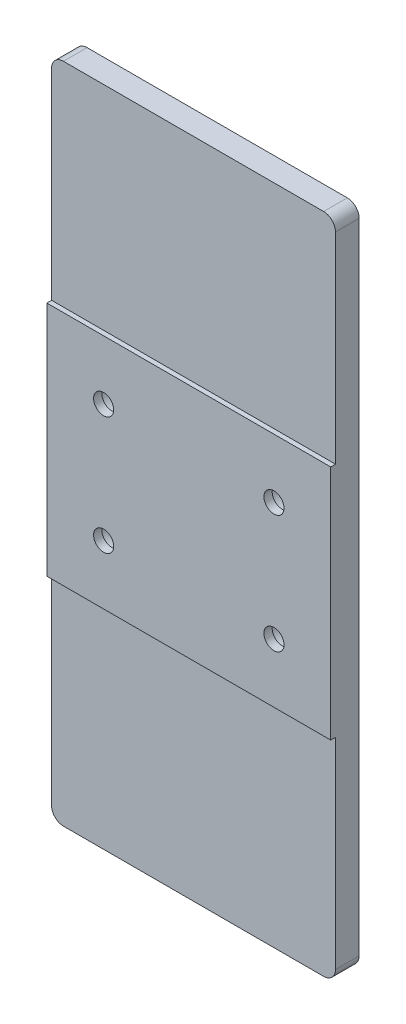
ISO-10303-21;
HEADER;
FILE_DESCRIPTION(('STEP AP214'),'2;1');
FILE_NAME('part.step','',(''),(''),'','','');
FILE_SCHEMA(('AUTOMOTIVE_DESIGN { 1 0 10303 214 1 1 1 1 }'));
ENDSEC;
DATA;
#1=APPLICATION_CONTEXT('core data for automotive mechanical design processes');
#2=APPLICATION_PROTOCOL_DEFINITION('international standard','automotive_design',2000,#1);
#3=PRODUCT_CONTEXT('',#1,'mechanical');
#4=PRODUCT('Part','Part','',(#3));
#5=PRODUCT_RELATED_PRODUCT_CATEGORY('part','',(#4));
#6=PRODUCT_DEFINITION_FORMATION('','',#4);
#7=PRODUCT_DEFINITION_CONTEXT('part definition',#1,'design');
#8=PRODUCT_DEFINITION('design','',#6,#7);
#9=PRODUCT_DEFINITION_SHAPE('','',#8);
#10=(LENGTH_UNIT() NAMED_UNIT(*) SI_UNIT(.MILLI.,.METRE.));
#11=(NAMED_UNIT(*) PLANE_ANGLE_UNIT() SI_UNIT($,.RADIAN.));
#12=(NAMED_UNIT(*) SI_UNIT($,.STERADIAN.) SOLID_ANGLE_UNIT());
#13=UNCERTAINTY_MEASURE_WITH_UNIT(LENGTH_MEASURE(1.E-05),#10,'distance_accuracy_value','');
#14=(GEOMETRIC_REPRESENTATION_CONTEXT(3) GLOBAL_UNCERTAINTY_ASSIGNED_CONTEXT((#13)) GLOBAL_UNIT_ASSIGNED_CONTEXT((#10,
#11,#12)) REPRESENTATION_CONTEXT('',''));
#15=CARTESIAN_POINT('',(0.,0.,0.));
#16=DIRECTION('',(0.,0.,1.));
#17=DIRECTION('',(1.,0.,0.));
#18=AXIS2_PLACEMENT_3D('',#15,#16,#17);
#19=CARTESIAN_POINT('',(36.,25.,10.));
#20=DIRECTION('',(0.,0.,-1.));
#21=DIRECTION('',(-1.,0.,0.));
#22=AXIS2_PLACEMENT_3D('',#19,#20,#21);
#23=CYLINDRICAL_SURFACE('',#22,4.25);
#24=CARTESIAN_POINT('',(36.,25.,12.));
#25=DIRECTION('',(0.,0.,-1.));
#26=DIRECTION('',(-1.,0.,0.));
#27=AXIS2_PLACEMENT_3D('',#24,#25,#26);
#28=CIRCLE('',#27,4.25);
#29=CARTESIAN_POINT('',(31.75,25.,12.));
#30=VERTEX_POINT('',#29);
#31=EDGE_CURVE('E226',#30,#30,#28,.T.);
#32=ORIENTED_EDGE('',*,*,#31,.F.);
#33=EDGE_LOOP('',(#32));
#34=FACE_BOUND('',#33,.T.);
#35=CARTESIAN_POINT('',(36.,25.,8.5));
#36=DIRECTION('',(0.,0.,-1.));
#37=DIRECTION('',(-1.,0.,0.));
#38=AXIS2_PLACEMENT_3D('',#35,#36,#37);
#39=CIRCLE('',#38,4.25);
#40=CARTESIAN_POINT('',(31.75,25.,8.5));
#41=VERTEX_POINT('',#40);
#42=EDGE_CURVE('E39',#41,#41,#39,.T.);
#43=ORIENTED_EDGE('',*,*,#42,.T.);
#44=EDGE_LOOP('',(#43));
#45=FACE_BOUND('',#44,.T.);
#46=ADVANCED_FACE('F35',(#34,#45),#23,.F.);
#47=CARTESIAN_POINT('',(36.,-25.,10.));
#48=DIRECTION('',(0.,0.,-1.));
#49=DIRECTION('',(-1.,0.,0.));
#50=AXIS2_PLACEMENT_3D('',#47,#48,#49);
#51=CYLINDRICAL_SURFACE('',#50,4.25);
#52=CARTESIAN_POINT('',(36.,-25.,12.));
#53=DIRECTION('',(0.,0.,-1.));
#54=DIRECTION('',(-1.,0.,0.));
#55=AXIS2_PLACEMENT_3D('',#52,#53,#54);
#56=CIRCLE('',#55,4.25);
#57=CARTESIAN_POINT('',(31.75,-25.,12.));
#58=VERTEX_POINT('',#57);
#59=EDGE_CURVE('E231',#58,#58,#56,.T.);
#60=ORIENTED_EDGE('',*,*,#59,.F.);
#61=EDGE_LOOP('',(#60));
#62=FACE_BOUND('',#61,.T.);
#63=CARTESIAN_POINT('',(36.,-25.,8.5));
#64=DIRECTION('',(0.,0.,-1.));
#65=DIRECTION('',(-1.,0.,0.));
#66=AXIS2_PLACEMENT_3D('',#63,#64,#65);
#67=CIRCLE('',#66,4.25);
#68=CARTESIAN_POINT('',(31.75,-25.,8.5));
#69=VERTEX_POINT('',#68);
#70=EDGE_CURVE('E217',#69,#69,#67,.T.);
#71=ORIENTED_EDGE('',*,*,#70,.T.);
#72=EDGE_LOOP('',(#71));
#73=FACE_BOUND('',#72,.T.);
#74=ADVANCED_FACE('F265',(#62,#73),#51,.F.);
#75=CARTESIAN_POINT('',(-36.,-25.,10.));
#76=DIRECTION('',(0.,0.,-1.));
#77=DIRECTION('',(-1.,0.,0.));
#78=AXIS2_PLACEMENT_3D('',#75,#76,#77);
#79=CYLINDRICAL_SURFACE('',#78,4.25);
#80=CARTESIAN_POINT('',(-36.,-25.,12.));
#81=DIRECTION('',(0.,0.,-1.));
#82=DIRECTION('',(-1.,0.,0.));
#83=AXIS2_PLACEMENT_3D('',#80,#81,#82);
#84=CIRCLE('',#83,4.25);
#85=CARTESIAN_POINT('',(-40.25,-25.,12.));
#86=VERTEX_POINT('',#85);
#87=EDGE_CURVE('E222',#86,#86,#84,.T.);
#88=ORIENTED_EDGE('',*,*,#87,.F.);
#89=EDGE_LOOP('',(#88));
#90=FACE_BOUND('',#89,.T.);
#91=CARTESIAN_POINT('',(-36.,-25.,8.5));
#92=DIRECTION('',(0.,0.,-1.));
#93=DIRECTION('',(-1.,0.,0.));
#94=AXIS2_PLACEMENT_3D('',#91,#92,#93);
#95=CIRCLE('',#94,4.25);
#96=CARTESIAN_POINT('',(-40.25,-25.,8.5));
#97=VERTEX_POINT('',#96);
#98=EDGE_CURVE('E214',#97,#97,#95,.T.);
#99=ORIENTED_EDGE('',*,*,#98,.T.);
#100=EDGE_LOOP('',(#99));
#101=FACE_BOUND('',#100,.T.);
#102=ADVANCED_FACE('F271',(#90,#101),#79,.F.);
#103=CARTESIAN_POINT('',(-36.,25.,10.));
#104=DIRECTION('',(0.,0.,-1.));
#105=DIRECTION('',(-1.,0.,0.));
#106=AXIS2_PLACEMENT_3D('',#103,#104,#105);
#107=CYLINDRICAL_SURFACE('',#106,4.25);
#108=CARTESIAN_POINT('',(-36.,25.,12.));
#109=DIRECTION('',(0.,0.,-1.));
#110=DIRECTION('',(-1.,0.,0.));
#111=AXIS2_PLACEMENT_3D('',#108,#109,#110);
#112=CIRCLE('',#111,4.25);
#113=CARTESIAN_POINT('',(-40.25,25.,12.));
#114=VERTEX_POINT('',#113);
#115=EDGE_CURVE('E239',#114,#114,#112,.T.);
#116=ORIENTED_EDGE('',*,*,#115,.F.);
#117=EDGE_LOOP('',(#116));
#118=FACE_BOUND('',#117,.T.);
#119=CARTESIAN_POINT('',(-36.,25.,8.5));
#120=DIRECTION('',(0.,0.,-1.));
#121=DIRECTION('',(-1.,0.,0.));
#122=AXIS2_PLACEMENT_3D('',#119,#120,#121);
#123=CIRCLE('',#122,4.25);
#124=CARTESIAN_POINT('',(-40.25,25.,8.5));
#125=VERTEX_POINT('',#124);
#126=EDGE_CURVE('E211',#125,#125,#123,.T.);
#127=ORIENTED_EDGE('',*,*,#126,.T.);
#128=EDGE_LOOP('',(#127));
#129=FACE_BOUND('',#128,.T.);
#130=ADVANCED_FACE('F330',(#118,#129),#107,.F.);
#131=CARTESIAN_POINT('',(0.,0.,10.));
#132=DIRECTION('',(0.,0.,1.));
#133=DIRECTION('',(1.,0.,0.));
#134=AXIS2_PLACEMENT_3D('',#131,#132,#133);
#135=PLANE('',#134);
#136=DIRECTION('',(1.,0.,0.));
#137=VECTOR('',#136,1.);
#138=CARTESIAN_POINT('',(60.,-50.,10.));
#139=LINE('',#138,#137);
#140=CARTESIAN_POINT('',(-60.,-50.,10.));
#141=VERTEX_POINT('',#140);
#142=CARTESIAN_POINT('',(60.,-50.,10.));
#143=VERTEX_POINT('',#142);
#144=EDGE_CURVE('E52',#141,#143,#139,.T.);
#145=ORIENTED_EDGE('',*,*,#144,.F.);
#146=DIRECTION('',(0.,-1.,0.));
#147=VECTOR('',#146,1.);
#148=CARTESIAN_POINT('',(-60.,140.,10.));
#149=LINE('',#148,#147);
#150=CARTESIAN_POINT('',(-60.,-135.,10.));
#151=VERTEX_POINT('',#150);
#152=EDGE_CURVE('E159',#141,#151,#149,.T.);
#153=ORIENTED_EDGE('',*,*,#152,.T.);
#154=CARTESIAN_POINT('',(-55.,-135.,10.));
#155=DIRECTION('',(0.,0.,1.));
#156=DIRECTION('',(1.,0.,0.));
#157=AXIS2_PLACEMENT_3D('',#154,#155,#156);
#158=CIRCLE('',#157,5.);
#159=CARTESIAN_POINT('',(-55.,-140.,10.));
#160=VERTEX_POINT('',#159);
#161=EDGE_CURVE('E199',#151,#160,#158,.T.);
#162=ORIENTED_EDGE('',*,*,#161,.T.);
#163=DIRECTION('',(1.,0.,0.));
#164=VECTOR('',#163,1.);
#165=CARTESIAN_POINT('',(-60.,-140.,10.));
#166=LINE('',#165,#164);
#167=CARTESIAN_POINT('',(55.,-140.,10.));
#168=VERTEX_POINT('',#167);
#169=EDGE_CURVE('E158',#160,#168,#166,.T.);
#170=ORIENTED_EDGE('',*,*,#169,.T.);
#171=CARTESIAN_POINT('',(55.,-135.,10.));
#172=DIRECTION('',(0.,0.,1.));
#173=DIRECTION('',(1.,0.,0.));
#174=AXIS2_PLACEMENT_3D('',#171,#172,#173);
#175=CIRCLE('',#174,5.);
#176=CARTESIAN_POINT('',(60.,-135.,10.));
#177=VERTEX_POINT('',#176);
#178=EDGE_CURVE('E201',#168,#177,#175,.T.);
#179=ORIENTED_EDGE('',*,*,#178,.T.);
#180=DIRECTION('',(0.,1.,0.));
#181=VECTOR('',#180,1.);
#182=CARTESIAN_POINT('',(60.,140.,10.));
#183=LINE('',#182,#181);
#184=EDGE_CURVE('E163',#177,#143,#183,.T.);
#185=ORIENTED_EDGE('',*,*,#184,.T.);
#186=EDGE_LOOP('',(#145,#153,#162,#170,#179,#185));
#187=FACE_BOUND('',#186,.T.);
#188=ADVANCED_FACE('F281',(#187),#135,.T.);
#189=DIRECTION('',(-1.,0.,0.));
#190=VECTOR('',#189,1.);
#191=CARTESIAN_POINT('',(-60.,50.,10.));
#192=LINE('',#191,#190);
#193=CARTESIAN_POINT('',(60.,50.,10.));
#194=VERTEX_POINT('',#193);
#195=CARTESIAN_POINT('',(-60.,50.,10.));
#196=VERTEX_POINT('',#195);
#197=EDGE_CURVE('E60',#194,#196,#192,.T.);
#198=ORIENTED_EDGE('',*,*,#197,.F.);
#199=CARTESIAN_POINT('',(60.,135.,10.));
#200=VERTEX_POINT('',#199);
#201=EDGE_CURVE('E162',#194,#200,#183,.T.);
#202=ORIENTED_EDGE('',*,*,#201,.T.);
#203=CARTESIAN_POINT('',(55.,135.,10.));
#204=DIRECTION('',(0.,0.,1.));
#205=DIRECTION('',(1.,0.,0.));
#206=AXIS2_PLACEMENT_3D('',#203,#204,#205);
#207=CIRCLE('',#206,5.);
#208=CARTESIAN_POINT('',(55.,140.,10.));
#209=VERTEX_POINT('',#208);
#210=EDGE_CURVE('E195',#200,#209,#207,.T.);
#211=ORIENTED_EDGE('',*,*,#210,.T.);
#212=DIRECTION('',(-1.,0.,0.));
#213=VECTOR('',#212,1.);
#214=CARTESIAN_POINT('',(-60.,140.,10.));
#215=LINE('',#214,#213);
#216=CARTESIAN_POINT('',(-55.,140.,10.));
#217=VERTEX_POINT('',#216);
#218=EDGE_CURVE('E165',#209,#217,#215,.T.);
#219=ORIENTED_EDGE('',*,*,#218,.T.);
#220=CARTESIAN_POINT('',(-55.,135.,10.));
#221=DIRECTION('',(0.,0.,1.));
#222=DIRECTION('',(1.,0.,0.));
#223=AXIS2_PLACEMENT_3D('',#220,#221,#222);
#224=CIRCLE('',#223,5.);
#225=CARTESIAN_POINT('',(-60.,135.,10.));
#226=VERTEX_POINT('',#225);
#227=EDGE_CURVE('E197',#217,#226,#224,.T.);
#228=ORIENTED_EDGE('',*,*,#227,.T.);
#229=EDGE_CURVE('E156',#226,#196,#149,.T.);
#230=ORIENTED_EDGE('',*,*,#229,.T.);
#231=EDGE_LOOP('',(#198,#202,#211,#219,#228,#230));
#232=FACE_BOUND('',#231,.T.);
#233=ADVANCED_FACE('F277',(#232),#135,.T.);
#234=CARTESIAN_POINT('',(0.,0.,0.));
#235=DIRECTION('',(0.,0.,1.));
#236=DIRECTION('',(1.,0.,0.));
#237=AXIS2_PLACEMENT_3D('',#234,#235,#236);
#238=PLANE('',#237);
#239=CARTESIAN_POINT('',(36.,25.,0.));
#240=DIRECTION('',(0.,0.,-1.));
#241=DIRECTION('',(-1.,0.,0.));
#242=AXIS2_PLACEMENT_3D('',#239,#240,#241);
#243=CIRCLE('',#242,7.);
#244=CARTESIAN_POINT('',(29.,25.,0.));
#245=VERTEX_POINT('',#244);
#246=EDGE_CURVE('E355',#245,#245,#243,.T.);
#247=ORIENTED_EDGE('',*,*,#246,.F.);
#248=EDGE_LOOP('',(#247));
#249=FACE_BOUND('',#248,.T.);
#250=CARTESIAN_POINT('',(36.,-25.,0.));
#251=DIRECTION('',(0.,0.,-1.));
#252=DIRECTION('',(-1.,0.,0.));
#253=AXIS2_PLACEMENT_3D('',#250,#251,#252);
#254=CIRCLE('',#253,7.);
#255=CARTESIAN_POINT('',(29.,-25.,0.));
#256=VERTEX_POINT('',#255);
#257=EDGE_CURVE('E361',#256,#256,#254,.T.);
#258=ORIENTED_EDGE('',*,*,#257,.F.);
#259=EDGE_LOOP('',(#258));
#260=FACE_BOUND('',#259,.T.);
#261=CARTESIAN_POINT('',(-36.,-25.,0.));
#262=DIRECTION('',(0.,0.,-1.));
#263=DIRECTION('',(-1.,0.,0.));
#264=AXIS2_PLACEMENT_3D('',#261,#262,#263);
#265=CIRCLE('',#264,7.);
#266=CARTESIAN_POINT('',(-43.,-25.,0.));
#267=VERTEX_POINT('',#266);
#268=EDGE_CURVE('E367',#267,#267,#265,.T.);
#269=ORIENTED_EDGE('',*,*,#268,.F.);
#270=EDGE_LOOP('',(#269));
#271=FACE_BOUND('',#270,.T.);
#272=CARTESIAN_POINT('',(-36.,25.,0.));
#273=DIRECTION('',(0.,0.,-1.));
#274=DIRECTION('',(-1.,0.,0.));
#275=AXIS2_PLACEMENT_3D('',#272,#273,#274);
#276=CIRCLE('',#275,7.);
#277=CARTESIAN_POINT('',(-43.,25.,0.));
#278=VERTEX_POINT('',#277);
#279=EDGE_CURVE('E234',#278,#278,#276,.T.);
#280=ORIENTED_EDGE('',*,*,#279,.F.);
#281=EDGE_LOOP('',(#280));
#282=FACE_BOUND('',#281,.T.);
#283=DIRECTION('',(0.,1.,0.));
#284=VECTOR('',#283,1.);
#285=CARTESIAN_POINT('',(60.,140.,0.));
#286=LINE('',#285,#284);
#287=CARTESIAN_POINT('',(60.,-135.,0.));
#288=VERTEX_POINT('',#287);
#289=CARTESIAN_POINT('',(60.,135.,0.));
#290=VERTEX_POINT('',#289);
#291=EDGE_CURVE('E171',#288,#290,#286,.T.);
#292=ORIENTED_EDGE('',*,*,#291,.F.);
#293=CARTESIAN_POINT('',(55.,-135.,0.));
#294=DIRECTION('',(0.,0.,1.));
#295=DIRECTION('',(1.,0.,0.));
#296=AXIS2_PLACEMENT_3D('',#293,#294,#295);
#297=CIRCLE('',#296,5.);
#298=CARTESIAN_POINT('',(55.,-140.,0.));
#299=VERTEX_POINT('',#298);
#300=EDGE_CURVE('E188',#288,#299,#297,.F.);
#301=ORIENTED_EDGE('',*,*,#300,.T.);
#302=DIRECTION('',(1.,0.,0.));
#303=VECTOR('',#302,1.);
#304=CARTESIAN_POINT('',(-60.,-140.,0.));
#305=LINE('',#304,#303);
#306=CARTESIAN_POINT('',(-55.,-140.,0.));
#307=VERTEX_POINT('',#306);
#308=EDGE_CURVE('E150',#307,#299,#305,.T.);
#309=ORIENTED_EDGE('',*,*,#308,.F.);
#310=CARTESIAN_POINT('',(-55.,-135.,0.));
#311=DIRECTION('',(0.,0.,1.));
#312=DIRECTION('',(1.,0.,0.));
#313=AXIS2_PLACEMENT_3D('',#310,#311,#312);
#314=CIRCLE('',#313,5.);
#315=CARTESIAN_POINT('',(-60.,-135.,0.));
#316=VERTEX_POINT('',#315);
#317=EDGE_CURVE('E186',#307,#316,#314,.F.);
#318=ORIENTED_EDGE('',*,*,#317,.T.);
#319=DIRECTION('',(0.,-1.,0.));
#320=VECTOR('',#319,1.);
#321=CARTESIAN_POINT('',(-60.,140.,0.));
#322=LINE('',#321,#320);
#323=CARTESIAN_POINT('',(-60.,135.,0.));
#324=VERTEX_POINT('',#323);
#325=EDGE_CURVE('E147',#324,#316,#322,.T.);
#326=ORIENTED_EDGE('',*,*,#325,.F.);
#327=CARTESIAN_POINT('',(-55.,135.,0.));
#328=DIRECTION('',(0.,0.,1.));
#329=DIRECTION('',(1.,0.,0.));
#330=AXIS2_PLACEMENT_3D('',#327,#328,#329);
#331=CIRCLE('',#330,5.);
#332=CARTESIAN_POINT('',(-55.,140.,0.));
#333=VERTEX_POINT('',#332);
#334=EDGE_CURVE('E184',#324,#333,#331,.F.);
#335=ORIENTED_EDGE('',*,*,#334,.T.);
#336=DIRECTION('',(-1.,0.,0.));
#337=VECTOR('',#336,1.);
#338=CARTESIAN_POINT('',(-60.,140.,0.));
#339=LINE('',#338,#337);
#340=CARTESIAN_POINT('',(55.,140.,0.));
#341=VERTEX_POINT('',#340);
#342=EDGE_CURVE('E174',#341,#333,#339,.T.);
#343=ORIENTED_EDGE('',*,*,#342,.F.);
#344=CARTESIAN_POINT('',(55.,135.,0.));
#345=DIRECTION('',(0.,0.,1.));
#346=DIRECTION('',(1.,0.,0.));
#347=AXIS2_PLACEMENT_3D('',#344,#345,#346);
#348=CIRCLE('',#347,5.);
#349=EDGE_CURVE('E182',#341,#290,#348,.F.);
#350=ORIENTED_EDGE('',*,*,#349,.T.);
#351=EDGE_LOOP('',(#292,#301,#309,#318,#326,#335,#343,#350));
#352=FACE_BOUND('',#351,.T.);
#353=ADVANCED_FACE('F280',(#249,#260,#271,#282,#352),#238,.F.);
#354=CARTESIAN_POINT('',(-60.,140.,10.));
#355=DIRECTION('',(1.,0.,0.));
#356=DIRECTION('',(0.,1.,0.));
#357=AXIS2_PLACEMENT_3D('',#354,#355,#356);
#358=PLANE('',#357);
#359=ORIENTED_EDGE('',*,*,#325,.T.);
#360=DIRECTION('',(0.,0.,-1.));
#361=VECTOR('',#360,1.);
#362=CARTESIAN_POINT('',(-60.,-135.,10.));
#363=LINE('',#362,#361);
#364=EDGE_CURVE('E206',#316,#151,#363,.F.);
#365=ORIENTED_EDGE('',*,*,#364,.T.);
#366=ORIENTED_EDGE('',*,*,#152,.F.);
#367=DIRECTION('',(0.,0.,-1.));
#368=VECTOR('',#367,1.);
#369=CARTESIAN_POINT('',(-60.,-50.,12.));
#370=LINE('',#369,#368);
#371=CARTESIAN_POINT('',(-60.,-50.,12.));
#372=VERTEX_POINT('',#371);
#373=EDGE_CURVE('E244',#372,#141,#370,.T.);
#374=ORIENTED_EDGE('',*,*,#373,.F.);
#375=DIRECTION('',(0.,-1.,0.));
#376=VECTOR('',#375,1.);
#377=CARTESIAN_POINT('',(-60.,-50.,12.));
#378=LINE('',#377,#376);
#379=CARTESIAN_POINT('',(-60.,50.,12.));
#380=VERTEX_POINT('',#379);
#381=EDGE_CURVE('E141',#380,#372,#378,.T.);
#382=ORIENTED_EDGE('',*,*,#381,.F.);
#383=DIRECTION('',(0.,0.,-1.));
#384=VECTOR('',#383,1.);
#385=CARTESIAN_POINT('',(-60.,50.,12.));
#386=LINE('',#385,#384);
#387=EDGE_CURVE('E152',#380,#196,#386,.T.);
#388=ORIENTED_EDGE('',*,*,#387,.T.);
#389=ORIENTED_EDGE('',*,*,#229,.F.);
#390=DIRECTION('',(0.,0.,-1.));
#391=VECTOR('',#390,1.);
#392=CARTESIAN_POINT('',(-60.,135.,10.));
#393=LINE('',#392,#391);
#394=EDGE_CURVE('E203',#226,#324,#393,.T.);
#395=ORIENTED_EDGE('',*,*,#394,.T.);
#396=EDGE_LOOP('',(#359,#365,#366,#374,#382,#388,#389,#395));
#397=FACE_BOUND('',#396,.T.);
#398=ADVANCED_FACE('F251',(#397),#358,.F.);
#399=CARTESIAN_POINT('',(-60.,-140.,10.));
#400=DIRECTION('',(0.,1.,0.));
#401=DIRECTION('',(0.,0.,1.));
#402=AXIS2_PLACEMENT_3D('',#399,#400,#401);
#403=PLANE('',#402);
#404=ORIENTED_EDGE('',*,*,#308,.T.);
#405=DIRECTION('',(0.,0.,-1.));
#406=VECTOR('',#405,1.);
#407=CARTESIAN_POINT('',(55.,-140.,10.));
#408=LINE('',#407,#406);
#409=EDGE_CURVE('E193',#299,#168,#408,.F.);
#410=ORIENTED_EDGE('',*,*,#409,.T.);
#411=ORIENTED_EDGE('',*,*,#169,.F.);
#412=DIRECTION('',(0.,0.,-1.));
#413=VECTOR('',#412,1.);
#414=CARTESIAN_POINT('',(-55.,-140.,10.));
#415=LINE('',#414,#413);
#416=EDGE_CURVE('E190',#160,#307,#415,.T.);
#417=ORIENTED_EDGE('',*,*,#416,.T.);
#418=EDGE_LOOP('',(#404,#410,#411,#417));
#419=FACE_BOUND('',#418,.T.);
#420=ADVANCED_FACE('F292',(#419),#403,.F.);
#421=CARTESIAN_POINT('',(60.,140.,10.));
#422=DIRECTION('',(-1.,0.,0.));
#423=DIRECTION('',(0.,-1.,0.));
#424=AXIS2_PLACEMENT_3D('',#421,#422,#423);
#425=PLANE('',#424);
#426=ORIENTED_EDGE('',*,*,#184,.F.);
#427=DIRECTION('',(0.,0.,-1.));
#428=VECTOR('',#427,1.);
#429=CARTESIAN_POINT('',(60.,-135.,10.));
#430=LINE('',#429,#428);
#431=EDGE_CURVE('E179',#177,#288,#430,.T.);
#432=ORIENTED_EDGE('',*,*,#431,.T.);
#433=ORIENTED_EDGE('',*,*,#291,.T.);
#434=DIRECTION('',(0.,0.,-1.));
#435=VECTOR('',#434,1.);
#436=CARTESIAN_POINT('',(60.,135.,10.));
#437=LINE('',#436,#435);
#438=EDGE_CURVE('E167',#290,#200,#437,.F.);
#439=ORIENTED_EDGE('',*,*,#438,.T.);
#440=ORIENTED_EDGE('',*,*,#201,.F.);
#441=DIRECTION('',(0.,0.,-1.));
#442=VECTOR('',#441,1.);
#443=CARTESIAN_POINT('',(60.,50.,12.));
#444=LINE('',#443,#442);
#445=CARTESIAN_POINT('',(60.,50.,12.));
#446=VERTEX_POINT('',#445);
#447=EDGE_CURVE('E132',#446,#194,#444,.T.);
#448=ORIENTED_EDGE('',*,*,#447,.F.);
#449=DIRECTION('',(0.,1.,0.));
#450=VECTOR('',#449,1.);
#451=CARTESIAN_POINT('',(60.,50.,12.));
#452=LINE('',#451,#450);
#453=CARTESIAN_POINT('',(60.,-50.,12.));
#454=VERTEX_POINT('',#453);
#455=EDGE_CURVE('E125',#454,#446,#452,.T.);
#456=ORIENTED_EDGE('',*,*,#455,.F.);
#457=DIRECTION('',(0.,0.,-1.));
#458=VECTOR('',#457,1.);
#459=CARTESIAN_POINT('',(60.,-50.,12.));
#460=LINE('',#459,#458);
#461=EDGE_CURVE('E130',#454,#143,#460,.T.);
#462=ORIENTED_EDGE('',*,*,#461,.T.);
#463=EDGE_LOOP('',(#426,#432,#433,#439,#440,#448,#456,#462));
#464=FACE_BOUND('',#463,.T.);
#465=ADVANCED_FACE('F128',(#464),#425,.F.);
#466=CARTESIAN_POINT('',(-60.,140.,10.));
#467=DIRECTION('',(0.,-1.,0.));
#468=DIRECTION('',(0.,0.,-1.));
#469=AXIS2_PLACEMENT_3D('',#466,#467,#468);
#470=PLANE('',#469);
#471=ORIENTED_EDGE('',*,*,#342,.T.);
#472=DIRECTION('',(0.,0.,-1.));
#473=VECTOR('',#472,1.);
#474=CARTESIAN_POINT('',(-55.,140.,10.));
#475=LINE('',#474,#473);
#476=EDGE_CURVE('E11',#333,#217,#475,.F.);
#477=ORIENTED_EDGE('',*,*,#476,.T.);
#478=ORIENTED_EDGE('',*,*,#218,.F.);
#479=DIRECTION('',(0.,0.,-1.));
#480=VECTOR('',#479,1.);
#481=CARTESIAN_POINT('',(55.,140.,10.));
#482=LINE('',#481,#480);
#483=EDGE_CURVE('E44',#209,#341,#482,.T.);
#484=ORIENTED_EDGE('',*,*,#483,.T.);
#485=EDGE_LOOP('',(#471,#477,#478,#484));
#486=FACE_BOUND('',#485,.T.);
#487=ADVANCED_FACE('F285',(#486),#470,.F.);
#488=CARTESIAN_POINT('',(55.,-135.,10.));
#489=DIRECTION('',(0.,0.,-1.));
#490=DIRECTION('',(-1.,0.,0.));
#491=AXIS2_PLACEMENT_3D('',#488,#489,#490);
#492=CYLINDRICAL_SURFACE('',#491,5.);
#493=ORIENTED_EDGE('',*,*,#178,.F.);
#494=ORIENTED_EDGE('',*,*,#409,.F.);
#495=ORIENTED_EDGE('',*,*,#300,.F.);
#496=ORIENTED_EDGE('',*,*,#431,.F.);
#497=EDGE_LOOP('',(#493,#494,#495,#496));
#498=FACE_BOUND('',#497,.T.);
#499=ADVANCED_FACE('F288',(#498),#492,.T.);
#500=CARTESIAN_POINT('',(-55.,-135.,10.));
#501=DIRECTION('',(0.,0.,-1.));
#502=DIRECTION('',(-1.,0.,0.));
#503=AXIS2_PLACEMENT_3D('',#500,#501,#502);
#504=CYLINDRICAL_SURFACE('',#503,5.);
#505=ORIENTED_EDGE('',*,*,#161,.F.);
#506=ORIENTED_EDGE('',*,*,#364,.F.);
#507=ORIENTED_EDGE('',*,*,#317,.F.);
#508=ORIENTED_EDGE('',*,*,#416,.F.);
#509=EDGE_LOOP('',(#505,#506,#507,#508));
#510=FACE_BOUND('',#509,.T.);
#511=ADVANCED_FACE('F300',(#510),#504,.T.);
#512=CARTESIAN_POINT('',(-55.,135.,10.));
#513=DIRECTION('',(0.,0.,-1.));
#514=DIRECTION('',(-1.,0.,0.));
#515=AXIS2_PLACEMENT_3D('',#512,#513,#514);
#516=CYLINDRICAL_SURFACE('',#515,5.);
#517=ORIENTED_EDGE('',*,*,#227,.F.);
#518=ORIENTED_EDGE('',*,*,#476,.F.);
#519=ORIENTED_EDGE('',*,*,#334,.F.);
#520=ORIENTED_EDGE('',*,*,#394,.F.);
#521=EDGE_LOOP('',(#517,#518,#519,#520));
#522=FACE_BOUND('',#521,.T.);
#523=ADVANCED_FACE('F303',(#522),#516,.T.);
#524=CARTESIAN_POINT('',(55.,135.,10.));
#525=DIRECTION('',(0.,0.,-1.));
#526=DIRECTION('',(-1.,0.,0.));
#527=AXIS2_PLACEMENT_3D('',#524,#525,#526);
#528=CYLINDRICAL_SURFACE('',#527,5.);
#529=ORIENTED_EDGE('',*,*,#210,.F.);
#530=ORIENTED_EDGE('',*,*,#438,.F.);
#531=ORIENTED_EDGE('',*,*,#349,.F.);
#532=ORIENTED_EDGE('',*,*,#483,.F.);
#533=EDGE_LOOP('',(#529,#530,#531,#532));
#534=FACE_BOUND('',#533,.T.);
#535=ADVANCED_FACE('F37',(#534),#528,.T.);
#536=CARTESIAN_POINT('',(0.,0.,12.));
#537=DIRECTION('',(0.,0.,-1.));
#538=DIRECTION('',(-1.,0.,0.));
#539=AXIS2_PLACEMENT_3D('',#536,#537,#538);
#540=PLANE('',#539);
#541=ORIENTED_EDGE('',*,*,#87,.T.);
#542=EDGE_LOOP('',(#541));
#543=FACE_BOUND('',#542,.T.);
#544=ORIENTED_EDGE('',*,*,#115,.T.);
#545=EDGE_LOOP('',(#544));
#546=FACE_BOUND('',#545,.T.);
#547=ORIENTED_EDGE('',*,*,#31,.T.);
#548=EDGE_LOOP('',(#547));
#549=FACE_BOUND('',#548,.T.);
#550=ORIENTED_EDGE('',*,*,#59,.T.);
#551=EDGE_LOOP('',(#550));
#552=FACE_BOUND('',#551,.T.);
#553=DIRECTION('',(1.,0.,0.));
#554=VECTOR('',#553,1.);
#555=CARTESIAN_POINT('',(60.,-50.,12.));
#556=LINE('',#555,#554);
#557=EDGE_CURVE('E136',#372,#454,#556,.T.);
#558=ORIENTED_EDGE('',*,*,#557,.T.);
#559=ORIENTED_EDGE('',*,*,#455,.T.);
#560=DIRECTION('',(-1.,0.,0.));
#561=VECTOR('',#560,1.);
#562=CARTESIAN_POINT('',(-60.,50.,12.));
#563=LINE('',#562,#561);
#564=EDGE_CURVE('E135',#446,#380,#563,.T.);
#565=ORIENTED_EDGE('',*,*,#564,.T.);
#566=ORIENTED_EDGE('',*,*,#381,.T.);
#567=EDGE_LOOP('',(#558,#559,#565,#566));
#568=FACE_BOUND('',#567,.T.);
#569=ADVANCED_FACE('F139',(#543,#546,#549,#552,#568),#540,.F.);
#570=CARTESIAN_POINT('',(-60.,50.,12.));
#571=DIRECTION('',(0.,-1.,0.));
#572=DIRECTION('',(1.,0.,0.));
#573=AXIS2_PLACEMENT_3D('',#570,#571,#572);
#574=PLANE('',#573);
#575=ORIENTED_EDGE('',*,*,#197,.T.);
#576=ORIENTED_EDGE('',*,*,#387,.F.);
#577=ORIENTED_EDGE('',*,*,#564,.F.);
#578=ORIENTED_EDGE('',*,*,#447,.T.);
#579=EDGE_LOOP('',(#575,#576,#577,#578));
#580=FACE_BOUND('',#579,.T.);
#581=ADVANCED_FACE('F254',(#580),#574,.F.);
#582=CARTESIAN_POINT('',(60.,-50.,12.));
#583=DIRECTION('',(0.,1.,0.));
#584=DIRECTION('',(-1.,0.,0.));
#585=AXIS2_PLACEMENT_3D('',#582,#583,#584);
#586=PLANE('',#585);
#587=ORIENTED_EDGE('',*,*,#144,.T.);
#588=ORIENTED_EDGE('',*,*,#461,.F.);
#589=ORIENTED_EDGE('',*,*,#557,.F.);
#590=ORIENTED_EDGE('',*,*,#373,.T.);
#591=EDGE_LOOP('',(#587,#588,#589,#590));
#592=FACE_BOUND('',#591,.T.);
#593=ADVANCED_FACE('F146',(#592),#586,.F.);
#594=CARTESIAN_POINT('',(-36.,25.,8.5));
#595=DIRECTION('',(0.,0.,-1.));
#596=DIRECTION('',(-1.,0.,0.));
#597=AXIS2_PLACEMENT_3D('',#594,#595,#596);
#598=CYLINDRICAL_SURFACE('',#597,7.);
#599=CARTESIAN_POINT('',(-36.,25.,8.5));
#600=DIRECTION('',(0.,0.,-1.));
#601=DIRECTION('',(-1.,0.,0.));
#602=AXIS2_PLACEMENT_3D('',#599,#600,#601);
#603=CIRCLE('',#602,7.);
#604=CARTESIAN_POINT('',(-43.,25.,8.5));
#605=VERTEX_POINT('',#604);
#606=EDGE_CURVE('E215',#605,#605,#603,.T.);
#607=ORIENTED_EDGE('',*,*,#606,.F.);
#608=EDGE_LOOP('',(#607));
#609=FACE_BOUND('',#608,.T.);
#610=ORIENTED_EDGE('',*,*,#279,.T.);
#611=EDGE_LOOP('',(#610));
#612=FACE_BOUND('',#611,.T.);
#613=ADVANCED_FACE('F261',(#609,#612),#598,.F.);
#614=CARTESIAN_POINT('',(-36.,25.,8.5));
#615=DIRECTION('',(0.,0.,-1.));
#616=DIRECTION('',(-1.,0.,0.));
#617=AXIS2_PLACEMENT_3D('',#614,#615,#616);
#618=PLANE('',#617);
#619=ORIENTED_EDGE('',*,*,#126,.F.);
#620=EDGE_LOOP('',(#619));
#621=FACE_BOUND('',#620,.T.);
#622=ORIENTED_EDGE('',*,*,#606,.T.);
#623=EDGE_LOOP('',(#622));
#624=FACE_BOUND('',#623,.T.);
#625=ADVANCED_FACE('F344',(#621,#624),#618,.T.);
#626=CARTESIAN_POINT('',(-36.,-25.,8.5));
#627=DIRECTION('',(0.,0.,-1.));
#628=DIRECTION('',(-1.,0.,0.));
#629=AXIS2_PLACEMENT_3D('',#626,#627,#628);
#630=CYLINDRICAL_SURFACE('',#629,7.);
#631=CARTESIAN_POINT('',(-36.,-25.,8.5));
#632=DIRECTION('',(0.,0.,-1.));
#633=DIRECTION('',(-1.,0.,0.));
#634=AXIS2_PLACEMENT_3D('',#631,#632,#633);
#635=CIRCLE('',#634,7.);
#636=CARTESIAN_POINT('',(-43.,-25.,8.5));
#637=VERTEX_POINT('',#636);
#638=EDGE_CURVE('E353',#637,#637,#635,.T.);
#639=ORIENTED_EDGE('',*,*,#638,.F.);
#640=EDGE_LOOP('',(#639));
#641=FACE_BOUND('',#640,.T.);
#642=ORIENTED_EDGE('',*,*,#268,.T.);
#643=EDGE_LOOP('',(#642));
#644=FACE_BOUND('',#643,.T.);
#645=ADVANCED_FACE('F347',(#641,#644),#630,.F.);
#646=CARTESIAN_POINT('',(-36.,-25.,8.5));
#647=DIRECTION('',(0.,0.,-1.));
#648=DIRECTION('',(-1.,0.,0.));
#649=AXIS2_PLACEMENT_3D('',#646,#647,#648);
#650=PLANE('',#649);
#651=ORIENTED_EDGE('',*,*,#98,.F.);
#652=EDGE_LOOP('',(#651));
#653=FACE_BOUND('',#652,.T.);
#654=ORIENTED_EDGE('',*,*,#638,.T.);
#655=EDGE_LOOP('',(#654));
#656=FACE_BOUND('',#655,.T.);
#657=ADVANCED_FACE('F373',(#653,#656),#650,.T.);
#658=CARTESIAN_POINT('',(36.,-25.,8.5));
#659=DIRECTION('',(0.,0.,-1.));
#660=DIRECTION('',(-1.,0.,0.));
#661=AXIS2_PLACEMENT_3D('',#658,#659,#660);
#662=CYLINDRICAL_SURFACE('',#661,7.);
#663=CARTESIAN_POINT('',(36.,-25.,8.5));
#664=DIRECTION('',(0.,0.,-1.));
#665=DIRECTION('',(-1.,0.,0.));
#666=AXIS2_PLACEMENT_3D('',#663,#664,#665);
#667=CIRCLE('',#666,7.);
#668=CARTESIAN_POINT('',(29.,-25.,8.5));
#669=VERTEX_POINT('',#668);
#670=EDGE_CURVE('E364',#669,#669,#667,.T.);
#671=ORIENTED_EDGE('',*,*,#670,.F.);
#672=EDGE_LOOP('',(#671));
#673=FACE_BOUND('',#672,.T.);
#674=ORIENTED_EDGE('',*,*,#257,.T.);
#675=EDGE_LOOP('',(#674));
#676=FACE_BOUND('',#675,.T.);
#677=ADVANCED_FACE('F397',(#673,#676),#662,.F.);
#678=CARTESIAN_POINT('',(36.,-25.,8.5));
#679=DIRECTION('',(0.,0.,-1.));
#680=DIRECTION('',(-1.,0.,0.));
#681=AXIS2_PLACEMENT_3D('',#678,#679,#680);
#682=PLANE('',#681);
#683=ORIENTED_EDGE('',*,*,#70,.F.);
#684=EDGE_LOOP('',(#683));
#685=FACE_BOUND('',#684,.T.);
#686=ORIENTED_EDGE('',*,*,#670,.T.);
#687=EDGE_LOOP('',(#686));
#688=FACE_BOUND('',#687,.T.);
#689=ADVANCED_FACE('F392',(#685,#688),#682,.T.);
#690=CARTESIAN_POINT('',(36.,25.,8.5));
#691=DIRECTION('',(0.,0.,-1.));
#692=DIRECTION('',(-1.,0.,0.));
#693=AXIS2_PLACEMENT_3D('',#690,#691,#692);
#694=CYLINDRICAL_SURFACE('',#693,7.);
#695=CARTESIAN_POINT('',(36.,25.,8.5));
#696=DIRECTION('',(0.,0.,-1.));
#697=DIRECTION('',(-1.,0.,0.));
#698=AXIS2_PLACEMENT_3D('',#695,#696,#697);
#699=CIRCLE('',#698,7.);
#700=CARTESIAN_POINT('',(29.,25.,8.5));
#701=VERTEX_POINT('',#700);
#702=EDGE_CURVE('E358',#701,#701,#699,.T.);
#703=ORIENTED_EDGE('',*,*,#702,.F.);
#704=EDGE_LOOP('',(#703));
#705=FACE_BOUND('',#704,.T.);
#706=ORIENTED_EDGE('',*,*,#246,.T.);
#707=EDGE_LOOP('',(#706));
#708=FACE_BOUND('',#707,.T.);
#709=ADVANCED_FACE('F388',(#705,#708),#694,.F.);
#710=CARTESIAN_POINT('',(36.,25.,8.5));
#711=DIRECTION('',(0.,0.,-1.));
#712=DIRECTION('',(-1.,0.,0.));
#713=AXIS2_PLACEMENT_3D('',#710,#711,#712);
#714=PLANE('',#713);
#715=ORIENTED_EDGE('',*,*,#42,.F.);
#716=EDGE_LOOP('',(#715));
#717=FACE_BOUND('',#716,.T.);
#718=ORIENTED_EDGE('',*,*,#702,.T.);
#719=EDGE_LOOP('',(#718));
#720=FACE_BOUND('',#719,.T.);
#721=ADVANCED_FACE('F391',(#717,#720),#714,.T.);
#722=CLOSED_SHELL('',(#46,#74,#102,#130,#188,#233,#353,#398,#420,#465,#487,#499,#511,#523,#535,
#569,#581,#593,#613,#625,#645,#657,#677,#689,#709,#721));
#723=MANIFOLD_SOLID_BREP('B2',#722);
#724=ADVANCED_BREP_SHAPE_REPRESENTATION('',(#18,#723),#14);
#725=SHAPE_DEFINITION_REPRESENTATION(#9,#724);
ENDSEC;
END-ISO-10303-21;
